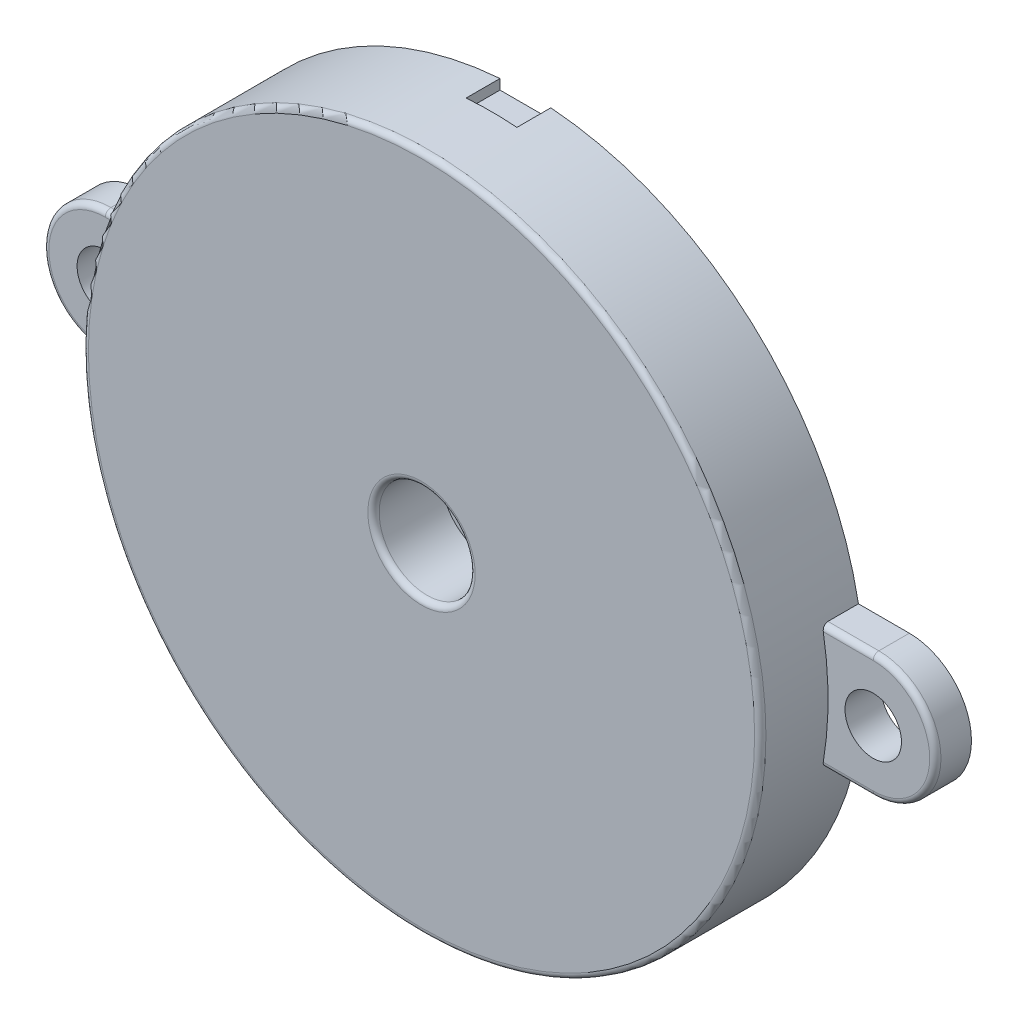
ISO-10303-21;
HEADER;
FILE_DESCRIPTION(('STEP AP214'),'2;1');
FILE_NAME('part.step','',(''),(''),'','','');
FILE_SCHEMA(('AUTOMOTIVE_DESIGN { 1 0 10303 214 1 1 1 1 }'));
ENDSEC;
DATA;
#1=APPLICATION_CONTEXT('core data for automotive mechanical design processes');
#2=APPLICATION_PROTOCOL_DEFINITION('international standard','automotive_design',2000,#1);
#3=PRODUCT_CONTEXT('',#1,'mechanical');
#4=PRODUCT('Part','Part','',(#3));
#5=PRODUCT_RELATED_PRODUCT_CATEGORY('part','',(#4));
#6=PRODUCT_DEFINITION_FORMATION('','',#4);
#7=PRODUCT_DEFINITION_CONTEXT('part definition',#1,'design');
#8=PRODUCT_DEFINITION('design','',#6,#7);
#9=PRODUCT_DEFINITION_SHAPE('','',#8);
#10=(LENGTH_UNIT() NAMED_UNIT(*) SI_UNIT(.MILLI.,.METRE.));
#11=(NAMED_UNIT(*) PLANE_ANGLE_UNIT() SI_UNIT($,.RADIAN.));
#12=(NAMED_UNIT(*) SI_UNIT($,.STERADIAN.) SOLID_ANGLE_UNIT());
#13=UNCERTAINTY_MEASURE_WITH_UNIT(LENGTH_MEASURE(1.E-05),#10,'distance_accuracy_value','');
#14=(GEOMETRIC_REPRESENTATION_CONTEXT(3) GLOBAL_UNCERTAINTY_ASSIGNED_CONTEXT((#13)) GLOBAL_UNIT_ASSIGNED_CONTEXT((#10,
#11,#12)) REPRESENTATION_CONTEXT('',''));
#15=CARTESIAN_POINT('',(0.,0.,0.));
#16=DIRECTION('',(0.,0.,1.));
#17=DIRECTION('',(1.,0.,0.));
#18=AXIS2_PLACEMENT_3D('',#15,#16,#17);
#19=CARTESIAN_POINT('',(-17.,0.,4.6));
#20=DIRECTION('',(0.,0.,1.));
#21=DIRECTION('',(1.,0.,0.));
#22=AXIS2_PLACEMENT_3D('',#19,#20,#21);
#23=PLANE('',#22);
#24=CARTESIAN_POINT('',(0.,0.,4.6));
#25=DIRECTION('',(0.,0.,1.));
#26=DIRECTION('',(1.,0.,0.));
#27=AXIS2_PLACEMENT_3D('',#24,#25,#26);
#28=CIRCLE('',#27,2.375);
#29=CARTESIAN_POINT('',(2.375,0.,4.6));
#30=VERTEX_POINT('',#29);
#31=EDGE_CURVE('E279',#30,#30,#28,.F.);
#32=ORIENTED_EDGE('',*,*,#31,.T.);
#33=EDGE_LOOP('',(#32));
#34=FACE_BOUND('',#33,.T.);
#35=CARTESIAN_POINT('',(0.,0.,4.6));
#36=DIRECTION('',(0.,0.,1.));
#37=DIRECTION('',(1.,0.,0.));
#38=AXIS2_PLACEMENT_3D('',#35,#36,#37);
#39=CIRCLE('',#38,14.75);
#40=CARTESIAN_POINT('',(14.75,0.,4.6));
#41=VERTEX_POINT('',#40);
#42=EDGE_CURVE('E276',#41,#41,#39,.T.);
#43=ORIENTED_EDGE('',*,*,#42,.T.);
#44=EDGE_LOOP('',(#43));
#45=FACE_BOUND('',#44,.T.);
#46=ADVANCED_FACE('F38',(#34,#45),#23,.T.);
#47=CARTESIAN_POINT('',(-17.,0.,4.6));
#48=DIRECTION('',(0.,0.,-1.));
#49=DIRECTION('',(-1.,0.,0.));
#50=AXIS2_PLACEMENT_3D('',#47,#48,#49);
#51=CYLINDRICAL_SURFACE('',#50,2.75);
#52=DIRECTION('',(0.,0.,-1.));
#53=VECTOR('',#52,1.);
#54=CARTESIAN_POINT('',(-17.,-2.75,4.6));
#55=LINE('',#54,#53);
#56=CARTESIAN_POINT('',(-17.,-2.75,1.35));
#57=VERTEX_POINT('',#56);
#58=CARTESIAN_POINT('',(-17.,-2.75,0.));
#59=VERTEX_POINT('',#58);
#60=EDGE_CURVE('E244',#57,#59,#55,.T.);
#61=ORIENTED_EDGE('',*,*,#60,.F.);
#62=CARTESIAN_POINT('',(-17.,0.,1.35));
#63=DIRECTION('',(0.,0.,1.));
#64=DIRECTION('',(1.,0.,0.));
#65=AXIS2_PLACEMENT_3D('',#62,#63,#64);
#66=CIRCLE('',#65,2.75);
#67=CARTESIAN_POINT('',(-17.,2.75,1.35));
#68=VERTEX_POINT('',#67);
#69=EDGE_CURVE('E284',#57,#68,#66,.F.);
#70=ORIENTED_EDGE('',*,*,#69,.T.);
#71=DIRECTION('',(0.,0.,-1.));
#72=VECTOR('',#71,1.);
#73=CARTESIAN_POINT('',(-17.,2.75,4.6));
#74=LINE('',#73,#72);
#75=CARTESIAN_POINT('',(-17.,2.75,0.));
#76=VERTEX_POINT('',#75);
#77=EDGE_CURVE('E230',#68,#76,#74,.T.);
#78=ORIENTED_EDGE('',*,*,#77,.T.);
#79=CARTESIAN_POINT('',(-17.,0.,0.));
#80=DIRECTION('',(0.,0.,1.));
#81=DIRECTION('',(1.,0.,0.));
#82=AXIS2_PLACEMENT_3D('',#79,#80,#81);
#83=CIRCLE('',#82,2.75);
#84=EDGE_CURVE('E205',#76,#59,#83,.T.);
#85=ORIENTED_EDGE('',*,*,#84,.T.);
#86=EDGE_LOOP('',(#61,#70,#78,#85));
#87=FACE_BOUND('',#86,.T.);
#88=ADVANCED_FACE('F316',(#87),#51,.T.);
#89=CARTESIAN_POINT('',(-17.,-2.75,4.6));
#90=DIRECTION('',(0.,1.,0.));
#91=DIRECTION('',(0.,0.,1.));
#92=AXIS2_PLACEMENT_3D('',#89,#90,#91);
#93=PLANE('',#92);
#94=DIRECTION('',(0.,0.,-1.));
#95=VECTOR('',#94,1.);
#96=CARTESIAN_POINT('',(-14.7457621030586,-2.75,4.6));
#97=LINE('',#96,#95);
#98=CARTESIAN_POINT('',(-14.7457621030586,-2.75,1.35));
#99=VERTEX_POINT('',#98);
#100=CARTESIAN_POINT('',(-14.7457621030586,-2.75,0.));
#101=VERTEX_POINT('',#100);
#102=EDGE_CURVE('E242',#99,#101,#97,.T.);
#103=ORIENTED_EDGE('',*,*,#102,.F.);
#104=DIRECTION('',(1.,0.,0.));
#105=VECTOR('',#104,1.);
#106=CARTESIAN_POINT('',(-17.,-2.75,1.35));
#107=LINE('',#106,#105);
#108=EDGE_CURVE('E60',#99,#57,#107,.F.);
#109=ORIENTED_EDGE('',*,*,#108,.T.);
#110=ORIENTED_EDGE('',*,*,#60,.T.);
#111=DIRECTION('',(1.,0.,0.));
#112=VECTOR('',#111,1.);
#113=CARTESIAN_POINT('',(-17.,-2.75,0.));
#114=LINE('',#113,#112);
#115=EDGE_CURVE('E208',#59,#101,#114,.T.);
#116=ORIENTED_EDGE('',*,*,#115,.T.);
#117=EDGE_LOOP('',(#103,#109,#110,#116));
#118=FACE_BOUND('',#117,.T.);
#119=ADVANCED_FACE('F361',(#118),#93,.F.);
#120=CARTESIAN_POINT('',(14.7457621030586,-2.75,4.6));
#121=DIRECTION('',(0.,1.,0.));
#122=DIRECTION('',(-1.,0.,0.));
#123=AXIS2_PLACEMENT_3D('',#120,#121,#122);
#124=PLANE('',#123);
#125=DIRECTION('',(0.,0.,-1.));
#126=VECTOR('',#125,1.);
#127=CARTESIAN_POINT('',(17.,-2.74999999999999,4.6));
#128=LINE('',#127,#126);
#129=CARTESIAN_POINT('',(17.,-2.74999999999999,1.35));
#130=VERTEX_POINT('',#129);
#131=CARTESIAN_POINT('',(17.,-2.74999999999999,0.));
#132=VERTEX_POINT('',#131);
#133=EDGE_CURVE('E238',#130,#132,#128,.T.);
#134=ORIENTED_EDGE('',*,*,#133,.F.);
#135=DIRECTION('',(1.,0.,0.));
#136=VECTOR('',#135,1.);
#137=CARTESIAN_POINT('',(14.7457621030586,-2.75,1.35));
#138=LINE('',#137,#136);
#139=CARTESIAN_POINT('',(14.7457621030586,-2.75,1.35));
#140=VERTEX_POINT('',#139);
#141=EDGE_CURVE('E259',#130,#140,#138,.F.);
#142=ORIENTED_EDGE('',*,*,#141,.T.);
#143=DIRECTION('',(0.,0.,-1.));
#144=VECTOR('',#143,1.);
#145=CARTESIAN_POINT('',(14.7457621030586,-2.75,4.6));
#146=LINE('',#145,#144);
#147=CARTESIAN_POINT('',(14.7457621030586,-2.75,0.));
#148=VERTEX_POINT('',#147);
#149=EDGE_CURVE('E240',#140,#148,#146,.T.);
#150=ORIENTED_EDGE('',*,*,#149,.T.);
#151=DIRECTION('',(1.,0.,0.));
#152=VECTOR('',#151,1.);
#153=CARTESIAN_POINT('',(14.7457621030586,-2.75,0.));
#154=LINE('',#153,#152);
#155=EDGE_CURVE('E214',#148,#132,#154,.T.);
#156=ORIENTED_EDGE('',*,*,#155,.T.);
#157=EDGE_LOOP('',(#134,#142,#150,#156));
#158=FACE_BOUND('',#157,.T.);
#159=ADVANCED_FACE('F619',(#158),#124,.F.);
#160=CARTESIAN_POINT('',(17.,0.,4.6));
#161=DIRECTION('',(0.,0.,-1.));
#162=DIRECTION('',(-1.,0.,0.));
#163=AXIS2_PLACEMENT_3D('',#160,#161,#162);
#164=CYLINDRICAL_SURFACE('',#163,2.75);
#165=DIRECTION('',(0.,0.,-1.));
#166=VECTOR('',#165,1.);
#167=CARTESIAN_POINT('',(17.,2.75,4.6));
#168=LINE('',#167,#166);
#169=CARTESIAN_POINT('',(17.,2.75,1.35));
#170=VERTEX_POINT('',#169);
#171=CARTESIAN_POINT('',(17.,2.75,0.));
#172=VERTEX_POINT('',#171);
#173=EDGE_CURVE('E236',#170,#172,#168,.T.);
#174=ORIENTED_EDGE('',*,*,#173,.F.);
#175=CARTESIAN_POINT('',(17.,0.,1.35));
#176=DIRECTION('',(0.,0.,1.));
#177=DIRECTION('',(1.,0.,0.));
#178=AXIS2_PLACEMENT_3D('',#175,#176,#177);
#179=CIRCLE('',#178,2.75);
#180=EDGE_CURVE('E282',#170,#130,#179,.F.);
#181=ORIENTED_EDGE('',*,*,#180,.T.);
#182=ORIENTED_EDGE('',*,*,#133,.T.);
#183=CARTESIAN_POINT('',(17.,0.,0.));
#184=DIRECTION('',(0.,0.,1.));
#185=DIRECTION('',(-1.,0.,0.));
#186=AXIS2_PLACEMENT_3D('',#183,#184,#185);
#187=CIRCLE('',#186,2.75);
#188=EDGE_CURVE('E217',#132,#172,#187,.T.);
#189=ORIENTED_EDGE('',*,*,#188,.T.);
#190=EDGE_LOOP('',(#174,#181,#182,#189));
#191=FACE_BOUND('',#190,.T.);
#192=ADVANCED_FACE('F381',(#191),#164,.T.);
#193=CARTESIAN_POINT('',(14.7457621030586,2.75,4.6));
#194=DIRECTION('',(0.,-1.,0.));
#195=DIRECTION('',(1.,0.,0.));
#196=AXIS2_PLACEMENT_3D('',#193,#194,#195);
#197=PLANE('',#196);
#198=DIRECTION('',(0.,0.,-1.));
#199=VECTOR('',#198,1.);
#200=CARTESIAN_POINT('',(14.7457621030586,2.75,4.6));
#201=LINE('',#200,#199);
#202=CARTESIAN_POINT('',(14.7457621030586,2.75,1.35));
#203=VERTEX_POINT('',#202);
#204=CARTESIAN_POINT('',(14.7457621030586,2.75,0.));
#205=VERTEX_POINT('',#204);
#206=EDGE_CURVE('E234',#203,#205,#201,.T.);
#207=ORIENTED_EDGE('',*,*,#206,.F.);
#208=DIRECTION('',(-1.,0.,0.));
#209=VECTOR('',#208,1.);
#210=CARTESIAN_POINT('',(17.,2.75,1.35));
#211=LINE('',#210,#209);
#212=EDGE_CURVE('E261',#203,#170,#211,.F.);
#213=ORIENTED_EDGE('',*,*,#212,.T.);
#214=ORIENTED_EDGE('',*,*,#173,.T.);
#215=DIRECTION('',(-1.,0.,0.));
#216=VECTOR('',#215,1.);
#217=CARTESIAN_POINT('',(14.7457621030586,2.75,0.));
#218=LINE('',#217,#216);
#219=EDGE_CURVE('E220',#172,#205,#218,.T.);
#220=ORIENTED_EDGE('',*,*,#219,.T.);
#221=EDGE_LOOP('',(#207,#213,#214,#220));
#222=FACE_BOUND('',#221,.T.);
#223=ADVANCED_FACE('F374',(#222),#197,.F.);
#224=CARTESIAN_POINT('',(-17.,2.75,4.6));
#225=DIRECTION('',(0.,-1.,0.));
#226=DIRECTION('',(0.,0.,-1.));
#227=AXIS2_PLACEMENT_3D('',#224,#225,#226);
#228=PLANE('',#227);
#229=ORIENTED_EDGE('',*,*,#77,.F.);
#230=DIRECTION('',(-1.,0.,0.));
#231=VECTOR('',#230,1.);
#232=CARTESIAN_POINT('',(-14.7457621030586,2.75,1.35));
#233=LINE('',#232,#231);
#234=CARTESIAN_POINT('',(-14.7457621030586,2.75,1.35));
#235=VERTEX_POINT('',#234);
#236=EDGE_CURVE('E270',#68,#235,#233,.F.);
#237=ORIENTED_EDGE('',*,*,#236,.T.);
#238=DIRECTION('',(0.,0.,-1.));
#239=VECTOR('',#238,1.);
#240=CARTESIAN_POINT('',(-14.7457621030586,2.75,4.6));
#241=LINE('',#240,#239);
#242=CARTESIAN_POINT('',(-14.7457621030586,2.75,0.));
#243=VERTEX_POINT('',#242);
#244=EDGE_CURVE('E232',#235,#243,#241,.T.);
#245=ORIENTED_EDGE('',*,*,#244,.T.);
#246=DIRECTION('',(-1.,0.,0.));
#247=VECTOR('',#246,1.);
#248=CARTESIAN_POINT('',(-17.,2.75,0.));
#249=LINE('',#248,#247);
#250=EDGE_CURVE('E227',#243,#76,#249,.T.);
#251=ORIENTED_EDGE('',*,*,#250,.T.);
#252=EDGE_LOOP('',(#229,#237,#245,#251));
#253=FACE_BOUND('',#252,.T.);
#254=ADVANCED_FACE('F372',(#253),#228,.F.);
#255=CARTESIAN_POINT('',(-17.,0.,4.6));
#256=DIRECTION('',(0.,0.,-1.));
#257=DIRECTION('',(-1.,0.,0.));
#258=AXIS2_PLACEMENT_3D('',#255,#256,#257);
#259=CYLINDRICAL_SURFACE('',#258,1.25);
#260=CARTESIAN_POINT('',(-17.,0.,0.));
#261=DIRECTION('',(0.,0.,1.));
#262=DIRECTION('',(1.,0.,0.));
#263=AXIS2_PLACEMENT_3D('',#260,#261,#262);
#264=CIRCLE('',#263,1.25);
#265=CARTESIAN_POINT('',(-15.75,0.,0.));
#266=VERTEX_POINT('',#265);
#267=EDGE_CURVE('E202',#266,#266,#264,.T.);
#268=ORIENTED_EDGE('',*,*,#267,.F.);
#269=EDGE_LOOP('',(#268));
#270=FACE_BOUND('',#269,.T.);
#271=CARTESIAN_POINT('',(-17.,0.,1.6));
#272=DIRECTION('',(0.,0.,1.));
#273=DIRECTION('',(1.,0.,0.));
#274=AXIS2_PLACEMENT_3D('',#271,#272,#273);
#275=CIRCLE('',#274,1.25);
#276=CARTESIAN_POINT('',(-15.75,0.,1.6));
#277=VERTEX_POINT('',#276);
#278=EDGE_CURVE('E188',#277,#277,#275,.F.);
#279=ORIENTED_EDGE('',*,*,#278,.F.);
#280=EDGE_LOOP('',(#279));
#281=FACE_BOUND('',#280,.T.);
#282=ADVANCED_FACE('F366',(#270,#281),#259,.F.);
#283=CARTESIAN_POINT('',(17.,0.,4.6));
#284=DIRECTION('',(0.,0.,-1.));
#285=DIRECTION('',(-1.,0.,0.));
#286=AXIS2_PLACEMENT_3D('',#283,#284,#285);
#287=CYLINDRICAL_SURFACE('',#286,1.25);
#288=CARTESIAN_POINT('',(17.,0.,0.));
#289=DIRECTION('',(0.,0.,1.));
#290=DIRECTION('',(1.,0.,0.));
#291=AXIS2_PLACEMENT_3D('',#288,#289,#290);
#292=CIRCLE('',#291,1.25);
#293=CARTESIAN_POINT('',(18.25,0.,0.));
#294=VERTEX_POINT('',#293);
#295=EDGE_CURVE('E192',#294,#294,#292,.T.);
#296=ORIENTED_EDGE('',*,*,#295,.F.);
#297=EDGE_LOOP('',(#296));
#298=FACE_BOUND('',#297,.T.);
#299=CARTESIAN_POINT('',(17.,0.,1.6));
#300=DIRECTION('',(0.,0.,1.));
#301=DIRECTION('',(1.,0.,0.));
#302=AXIS2_PLACEMENT_3D('',#299,#300,#301);
#303=CIRCLE('',#302,1.25);
#304=CARTESIAN_POINT('',(18.25,0.,1.6));
#305=VERTEX_POINT('',#304);
#306=EDGE_CURVE('E189',#305,#305,#303,.F.);
#307=ORIENTED_EDGE('',*,*,#306,.F.);
#308=EDGE_LOOP('',(#307));
#309=FACE_BOUND('',#308,.T.);
#310=ADVANCED_FACE('F370',(#298,#309),#287,.F.);
#311=CARTESIAN_POINT('',(-17.,0.,0.));
#312=DIRECTION('',(0.,0.,1.));
#313=DIRECTION('',(1.,0.,0.));
#314=AXIS2_PLACEMENT_3D('',#311,#312,#313);
#315=PLANE('',#314);
#316=CARTESIAN_POINT('',(0.,0.,0.));
#317=DIRECTION('',(0.,0.,1.));
#318=DIRECTION('',(-1.,0.,0.));
#319=AXIS2_PLACEMENT_3D('',#316,#317,#318);
#320=CIRCLE('',#319,15.);
#321=CARTESIAN_POINT('',(-1.125,14.9577530063843,0.));
#322=VERTEX_POINT('',#321);
#323=EDGE_CURVE('E223',#322,#243,#320,.T.);
#324=ORIENTED_EDGE('',*,*,#323,.F.);
#325=DIRECTION('',(0.,1.,0.));
#326=VECTOR('',#325,1.);
#327=CARTESIAN_POINT('',(-1.125,14.5127200409795,0.));
#328=LINE('',#327,#326);
#329=CARTESIAN_POINT('',(-1.125,14.5127200409795,0.));
#330=VERTEX_POINT('',#329);
#331=EDGE_CURVE('E178',#330,#322,#328,.T.);
#332=ORIENTED_EDGE('',*,*,#331,.F.);
#333=DIRECTION('',(-1.,0.,0.));
#334=VECTOR('',#333,1.);
#335=CARTESIAN_POINT('',(1.125,14.5127200409795,0.));
#336=LINE('',#335,#334);
#337=CARTESIAN_POINT('',(1.125,14.5127200409795,0.));
#338=VERTEX_POINT('',#337);
#339=EDGE_CURVE('E182',#338,#330,#336,.T.);
#340=ORIENTED_EDGE('',*,*,#339,.F.);
#341=DIRECTION('',(0.,-1.,0.));
#342=VECTOR('',#341,1.);
#343=CARTESIAN_POINT('',(1.125,14.5127200409795,0.));
#344=LINE('',#343,#342);
#345=CARTESIAN_POINT('',(1.125,14.9577530063843,0.));
#346=VERTEX_POINT('',#345);
#347=EDGE_CURVE('E167',#346,#338,#344,.T.);
#348=ORIENTED_EDGE('',*,*,#347,.F.);
#349=EDGE_CURVE('E224',#205,#346,#320,.T.);
#350=ORIENTED_EDGE('',*,*,#349,.F.);
#351=ORIENTED_EDGE('',*,*,#219,.F.);
#352=ORIENTED_EDGE('',*,*,#188,.F.);
#353=ORIENTED_EDGE('',*,*,#155,.F.);
#354=CARTESIAN_POINT('',(0.,0.,0.));
#355=DIRECTION('',(0.,0.,1.));
#356=DIRECTION('',(1.,0.,0.));
#357=AXIS2_PLACEMENT_3D('',#354,#355,#356);
#358=CIRCLE('',#357,15.);
#359=EDGE_CURVE('E211',#101,#148,#358,.T.);
#360=ORIENTED_EDGE('',*,*,#359,.F.);
#361=ORIENTED_EDGE('',*,*,#115,.F.);
#362=ORIENTED_EDGE('',*,*,#84,.F.);
#363=ORIENTED_EDGE('',*,*,#250,.F.);
#364=EDGE_LOOP('',(#324,#332,#340,#348,#350,#351,#352,#353,#360,#361,#362,#363));
#365=FACE_BOUND('',#364,.T.);
#366=ORIENTED_EDGE('',*,*,#267,.T.);
#367=EDGE_LOOP('',(#366));
#368=FACE_BOUND('',#367,.T.);
#369=ORIENTED_EDGE('',*,*,#295,.T.);
#370=EDGE_LOOP('',(#369));
#371=FACE_BOUND('',#370,.T.);
#372=ADVANCED_FACE('F368',(#365,#368,#371),#315,.F.);
#373=CARTESIAN_POINT('',(0.,0.,4.6));
#374=DIRECTION('',(0.,0.,-1.));
#375=DIRECTION('',(-1.,0.,0.));
#376=AXIS2_PLACEMENT_3D('',#373,#374,#375);
#377=CYLINDRICAL_SURFACE('',#376,15.);
#378=CARTESIAN_POINT('',(0.,0.,4.35));
#379=DIRECTION('',(0.,0.,1.));
#380=DIRECTION('',(1.,0.,0.));
#381=AXIS2_PLACEMENT_3D('',#378,#379,#380);
#382=CIRCLE('',#381,15.);
#383=CARTESIAN_POINT('',(15.,0.,4.35));
#384=VERTEX_POINT('',#383);
#385=EDGE_CURVE('E286',#384,#384,#382,.F.);
#386=ORIENTED_EDGE('',*,*,#385,.T.);
#387=EDGE_LOOP('',(#386));
#388=FACE_BOUND('',#387,.T.);
#389=CARTESIAN_POINT('',(0.,0.,1.5));
#390=DIRECTION('',(0.,0.,1.));
#391=DIRECTION('',(1.,0.,0.));
#392=AXIS2_PLACEMENT_3D('',#389,#390,#391);
#393=CIRCLE('',#392,15.);
#394=CARTESIAN_POINT('',(1.125,14.9577530063843,1.5));
#395=VERTEX_POINT('',#394);
#396=CARTESIAN_POINT('',(-1.125,14.9577530063843,1.5));
#397=VERTEX_POINT('',#396);
#398=EDGE_CURVE('E158',#395,#397,#393,.T.);
#399=ORIENTED_EDGE('',*,*,#398,.T.);
#400=DIRECTION('',(0.,0.,-1.));
#401=VECTOR('',#400,1.);
#402=CARTESIAN_POINT('',(-1.125,14.9577530063843,4.6));
#403=LINE('',#402,#401);
#404=EDGE_CURVE('E249',#397,#322,#403,.T.);
#405=ORIENTED_EDGE('',*,*,#404,.T.);
#406=ORIENTED_EDGE('',*,*,#323,.T.);
#407=ORIENTED_EDGE('',*,*,#244,.F.);
#408=CARTESIAN_POINT('',(-14.7457621030586,2.75,1.35));
#409=CARTESIAN_POINT('',(-14.7457591753939,2.75001269678549,1.36389687428884));
#410=CARTESIAN_POINT('',(-14.74597804399,2.74884206314095,1.37778864744794));
#411=CARTESIAN_POINT('',(-14.7468374042895,2.74422965962808,1.40515881181395));
#412=CARTESIAN_POINT('',(-14.7474773517124,2.74079082159479,1.4186377131864));
#413=CARTESIAN_POINT('',(-14.7491572566467,2.73173572289382,1.44482073736289));
#414=CARTESIAN_POINT('',(-14.7501973345323,2.72611880697462,1.45752462568021));
#415=CARTESIAN_POINT('',(-14.7526374663595,2.71288282158135,1.48180270274866));
#416=CARTESIAN_POINT('',(-14.754037509374,2.70526381288259,1.49337692577717));
#417=CARTESIAN_POINT('',(-14.7571596297769,2.68818067221447,1.51517039517052));
#418=CARTESIAN_POINT('',(-14.7588841298336,2.67870263494878,1.52537838910806));
#419=CARTESIAN_POINT('',(-14.762588348898,2.65821245594887,1.54406473443909));
#420=CARTESIAN_POINT('',(-14.7645681267648,2.64719996036903,1.55254268577078));
#421=CARTESIAN_POINT('',(-14.7687505633916,2.62376647620365,1.56766826169502));
#422=CARTESIAN_POINT('',(-14.7709562682722,2.61132585797252,1.57428460371459));
#423=CARTESIAN_POINT('',(-14.7754928990736,2.58553296271886,1.58533111060345));
#424=CARTESIAN_POINT('',(-14.7778237749413,2.57218104953233,1.58976214221612));
#425=CARTESIAN_POINT('',(-14.7818407761201,2.54897587882518,1.59535439320125));
#426=CARTESIAN_POINT('',(-14.7835137041685,2.53925579009771,1.59709509025225));
#427=CARTESIAN_POINT('',(-14.7868607364716,2.5196922662949,1.59941787672974));
#428=CARTESIAN_POINT('',(-14.7885348359887,2.50984901809,1.60000154742927));
#429=CARTESIAN_POINT('',(-14.790199457749,2.5,1.6));
#430=B_SPLINE_CURVE_WITH_KNOTS('',3,(#408,#409,#410,#411,#412,#413,#414,#415,#416,#417,#418,
#419,#420,#421,#422,#423,#424,#425,#426,#427,#428,#429),.UNSPECIFIED.,.F.,.F.,(4,2,2,2,2,2,2,2,
2,2,4),(0.,0.041632088029495,0.0832104684457068,0.124801366990873,0.166391003153302,
0.208304481384927,0.250227640896948,0.292818118601421,0.335391690349411,0.365373835700165,
0.395314977029406),.UNSPECIFIED.);
#431=CARTESIAN_POINT('',(-14.790199457749,2.5,1.6));
#432=VERTEX_POINT('',#431);
#433=EDGE_CURVE('E47',#235,#432,#430,.T.);
#434=ORIENTED_EDGE('',*,*,#433,.T.);
#435=CARTESIAN_POINT('',(0.,0.,1.6));
#436=DIRECTION('',(0.,0.,1.));
#437=DIRECTION('',(1.,0.,0.));
#438=AXIS2_PLACEMENT_3D('',#435,#436,#437);
#439=CIRCLE('',#438,15.);
#440=CARTESIAN_POINT('',(-14.790199457749,-2.5,1.6));
#441=VERTEX_POINT('',#440);
#442=EDGE_CURVE('E186',#432,#441,#439,.T.);
#443=ORIENTED_EDGE('',*,*,#442,.T.);
#444=CARTESIAN_POINT('',(-14.790199457749,-2.5,1.6));
#445=CARTESIAN_POINT('',(-14.7877939174117,-2.51423618618819,1.60001110324502));
#446=CARTESIAN_POINT('',(-14.7853667591021,-2.52846569132743,1.59878464281638));
#447=CARTESIAN_POINT('',(-14.7805428116712,-2.55651132523774,1.59394135401591));
#448=CARTESIAN_POINT('',(-14.7781460102417,-2.57032762485102,1.59032552823157));
#449=CARTESIAN_POINT('',(-14.7734529282084,-2.59716695019956,1.58078546488172));
#450=CARTESIAN_POINT('',(-14.7711567046747,-2.61018952715827,1.5748599351401));
#451=CARTESIAN_POINT('',(-14.7667411434912,-2.6350550536495,1.56086371083575));
#452=CARTESIAN_POINT('',(-14.7646217595381,-2.64689831212934,1.55279358013965));
#453=CARTESIAN_POINT('',(-14.7606425568051,-2.66899926492166,1.5347741253535));
#454=CARTESIAN_POINT('',(-14.7587814040234,-2.67926513990942,1.52483513565477));
#455=CARTESIAN_POINT('',(-14.7553718302988,-2.69797940177209,1.50332116209417));
#456=CARTESIAN_POINT('',(-14.7538234577915,-2.70642750717015,1.49174592532289));
#457=CARTESIAN_POINT('',(-14.7511181492783,-2.72113371021143,1.46746719882671));
#458=CARTESIAN_POINT('',(-14.7499559476862,-2.72742131137901,1.45478214573685));
#459=CARTESIAN_POINT('',(-14.7480384679688,-2.73777085886735,1.42851064001534));
#460=CARTESIAN_POINT('',(-14.7472828537276,-2.74183464361165,1.41492494239421));
#461=CARTESIAN_POINT('',(-14.746418820012,-2.74647684802593,1.39269655807596));
#462=CARTESIAN_POINT('',(-14.7461727805492,-2.7477972392028,1.38420703391143));
#463=CARTESIAN_POINT('',(-14.7458444237297,-2.74955860048462,1.36714633719354));
#464=CARTESIAN_POINT('',(-14.7457618743563,-2.75000081685312,1.35857529771705));
#465=CARTESIAN_POINT('',(-14.7457621030587,-2.75000000000046,1.35000000000009));
#466=B_SPLINE_CURVE_WITH_KNOTS('',3,(#444,#445,#446,#447,#448,#449,#450,#451,#452,#453,#454,
#455,#456,#457,#458,#459,#460,#461,#462,#463,#464,#465),.UNSPECIFIED.,.F.,.F.,(4,2,2,2,2,2,2,2,
2,2,4),(0.,0.0432579163164009,0.0864976929496637,0.12976169510576,0.173014333361319,
0.21603447602051,0.259061275449629,0.30147469118047,0.343852990670455,0.369595343869783,
0.395301138574669),.UNSPECIFIED.);
#467=EDGE_CURVE('E11',#441,#99,#466,.T.);
#468=ORIENTED_EDGE('',*,*,#467,.T.);
#469=ORIENTED_EDGE('',*,*,#102,.T.);
#470=ORIENTED_EDGE('',*,*,#359,.T.);
#471=ORIENTED_EDGE('',*,*,#149,.F.);
#472=CARTESIAN_POINT('',(14.7457621030586,-2.75,1.35));
#473=CARTESIAN_POINT('',(14.7457591753939,-2.75001269678549,1.36389687428884));
#474=CARTESIAN_POINT('',(14.74597804399,-2.74884206314095,1.37778864744794));
#475=CARTESIAN_POINT('',(14.7468374042895,-2.74422965962808,1.40515881181395));
#476=CARTESIAN_POINT('',(14.7474773517124,-2.74079082159479,1.4186377131864));
#477=CARTESIAN_POINT('',(14.7491572566467,-2.73173572289382,1.44482073736289));
#478=CARTESIAN_POINT('',(14.7501973345323,-2.72611880697462,1.45752462568021));
#479=CARTESIAN_POINT('',(14.7526374663595,-2.71288282158135,1.48180270274866));
#480=CARTESIAN_POINT('',(14.754037509374,-2.70526381288259,1.49337692577717));
#481=CARTESIAN_POINT('',(14.7571596297769,-2.68818067221447,1.51517039517052));
#482=CARTESIAN_POINT('',(14.7588841298336,-2.67870263494878,1.52537838910806));
#483=CARTESIAN_POINT('',(14.762588348898,-2.65821245594887,1.54406473443909));
#484=CARTESIAN_POINT('',(14.7645681267648,-2.64719996036903,1.55254268577078));
#485=CARTESIAN_POINT('',(14.7687505633916,-2.62376647620365,1.56766826169502));
#486=CARTESIAN_POINT('',(14.7709562682722,-2.61132585797252,1.57428460371459));
#487=CARTESIAN_POINT('',(14.7754928990736,-2.58553296271886,1.58533111060345));
#488=CARTESIAN_POINT('',(14.7778237749413,-2.57218104953233,1.58976214221612));
#489=CARTESIAN_POINT('',(14.7818407761201,-2.54897587882518,1.59535439320125));
#490=CARTESIAN_POINT('',(14.7835137041685,-2.53925579009771,1.59709509025225));
#491=CARTESIAN_POINT('',(14.7868607364716,-2.5196922662949,1.59941787672974));
#492=CARTESIAN_POINT('',(14.7885348359887,-2.50984901809,1.60000154742927));
#493=CARTESIAN_POINT('',(14.790199457749,-2.5,1.6));
#494=B_SPLINE_CURVE_WITH_KNOTS('',3,(#472,#473,#474,#475,#476,#477,#478,#479,#480,#481,#482,
#483,#484,#485,#486,#487,#488,#489,#490,#491,#492,#493),.UNSPECIFIED.,.F.,.F.,(4,2,2,2,2,2,2,2,
2,2,4),(0.,0.0416320880294948,0.0832104684457068,0.124801366990873,0.166391003153302,
0.208304481384927,0.250227640896947,0.29281811860142,0.335391690349411,0.365373835700165,
0.395314977029406),.UNSPECIFIED.);
#495=CARTESIAN_POINT('',(14.790199457749,-2.5,1.6));
#496=VERTEX_POINT('',#495);
#497=EDGE_CURVE('E289',#140,#496,#494,.T.);
#498=ORIENTED_EDGE('',*,*,#497,.T.);
#499=CARTESIAN_POINT('',(0.,0.,1.6));
#500=DIRECTION('',(0.,0.,1.));
#501=DIRECTION('',(1.,0.,0.));
#502=AXIS2_PLACEMENT_3D('',#499,#500,#501);
#503=CIRCLE('',#502,15.);
#504=CARTESIAN_POINT('',(14.790199457749,2.5,1.6));
#505=VERTEX_POINT('',#504);
#506=EDGE_CURVE('E193',#496,#505,#503,.T.);
#507=ORIENTED_EDGE('',*,*,#506,.T.);
#508=CARTESIAN_POINT('',(14.790199457749,2.5,1.6));
#509=CARTESIAN_POINT('',(14.7877939174117,2.51423618618819,1.60001110324502));
#510=CARTESIAN_POINT('',(14.7853667591021,2.52846569132743,1.59878464281638));
#511=CARTESIAN_POINT('',(14.7805428116712,2.55651132523774,1.59394135401591));
#512=CARTESIAN_POINT('',(14.7781460102417,2.57032762485102,1.59032552823157));
#513=CARTESIAN_POINT('',(14.7734529282084,2.59716695019956,1.58078546488172));
#514=CARTESIAN_POINT('',(14.7711567046747,2.61018952715827,1.5748599351401));
#515=CARTESIAN_POINT('',(14.7667411434912,2.6350550536495,1.56086371083575));
#516=CARTESIAN_POINT('',(14.7646217595381,2.64689831212934,1.55279358013965));
#517=CARTESIAN_POINT('',(14.7606425568051,2.66899926492166,1.5347741253535));
#518=CARTESIAN_POINT('',(14.7587814040234,2.67926513990942,1.52483513565477));
#519=CARTESIAN_POINT('',(14.7553718302988,2.69797940177209,1.50332116209417));
#520=CARTESIAN_POINT('',(14.7538234577915,2.70642750717015,1.49174592532289));
#521=CARTESIAN_POINT('',(14.7511181492783,2.72113371021143,1.46746719882671));
#522=CARTESIAN_POINT('',(14.7499559476862,2.72742131137901,1.45478214573686));
#523=CARTESIAN_POINT('',(14.7480384679688,2.73777085886735,1.42851064001534));
#524=CARTESIAN_POINT('',(14.7472828537276,2.74183464361165,1.41492494239421));
#525=CARTESIAN_POINT('',(14.746418820012,2.74647684802593,1.39269655807596));
#526=CARTESIAN_POINT('',(14.7461727805492,2.7477972392028,1.38420703391143));
#527=CARTESIAN_POINT('',(14.7458444237297,2.74955860048462,1.36714633719354));
#528=CARTESIAN_POINT('',(14.7457618743563,2.75000081685312,1.35857529771705));
#529=CARTESIAN_POINT('',(14.7457621030587,2.75000000000046,1.35000000000009));
#530=B_SPLINE_CURVE_WITH_KNOTS('',3,(#508,#509,#510,#511,#512,#513,#514,#515,#516,#517,#518,
#519,#520,#521,#522,#523,#524,#525,#526,#527,#528,#529),.UNSPECIFIED.,.F.,.F.,(4,2,2,2,2,2,2,2,
2,2,4),(0.,0.0432579163164009,0.0864976929496633,0.129761695105759,0.173014333361319,
0.216034476020509,0.259061275449629,0.301474691180469,0.343852990670454,0.369595343869783,
0.395301138574669),.UNSPECIFIED.);
#531=EDGE_CURVE('E297',#505,#203,#530,.T.);
#532=ORIENTED_EDGE('',*,*,#531,.T.);
#533=ORIENTED_EDGE('',*,*,#206,.T.);
#534=ORIENTED_EDGE('',*,*,#349,.T.);
#535=DIRECTION('',(0.,0.,-1.));
#536=VECTOR('',#535,1.);
#537=CARTESIAN_POINT('',(1.125,14.9577530063843,4.6));
#538=LINE('',#537,#536);
#539=EDGE_CURVE('E247',#346,#395,#538,.F.);
#540=ORIENTED_EDGE('',*,*,#539,.T.);
#541=EDGE_LOOP('',(#399,#405,#406,#407,#434,#443,#468,#469,#470,#471,#498,#507,#532,#533,#534,#540));
#542=FACE_BOUND('',#541,.T.);
#543=ADVANCED_FACE('F304',(#388,#542),#377,.T.);
#544=CARTESIAN_POINT('',(0.,0.,1.6));
#545=DIRECTION('',(0.,0.,1.));
#546=DIRECTION('',(1.,0.,0.));
#547=AXIS2_PLACEMENT_3D('',#544,#545,#546);
#548=PLANE('',#547);
#549=ORIENTED_EDGE('',*,*,#506,.F.);
#550=DIRECTION('',(1.,0.,0.));
#551=VECTOR('',#550,1.);
#552=CARTESIAN_POINT('',(17.,-2.49999999999999,1.6));
#553=LINE('',#552,#551);
#554=CARTESIAN_POINT('',(17.,-2.49999999999999,1.6));
#555=VERTEX_POINT('',#554);
#556=EDGE_CURVE('E256',#496,#555,#553,.T.);
#557=ORIENTED_EDGE('',*,*,#556,.T.);
#558=CARTESIAN_POINT('',(17.,0.,1.6));
#559=DIRECTION('',(0.,0.,1.));
#560=DIRECTION('',(1.,0.,0.));
#561=AXIS2_PLACEMENT_3D('',#558,#559,#560);
#562=CIRCLE('',#561,2.5);
#563=CARTESIAN_POINT('',(17.,2.5,1.6));
#564=VERTEX_POINT('',#563);
#565=EDGE_CURVE('E252',#555,#564,#562,.T.);
#566=ORIENTED_EDGE('',*,*,#565,.T.);
#567=DIRECTION('',(-1.,0.,0.));
#568=VECTOR('',#567,1.);
#569=CARTESIAN_POINT('',(14.7457621030586,2.5,1.6));
#570=LINE('',#569,#568);
#571=EDGE_CURVE('E254',#564,#505,#570,.T.);
#572=ORIENTED_EDGE('',*,*,#571,.T.);
#573=EDGE_LOOP('',(#549,#557,#566,#572));
#574=FACE_BOUND('',#573,.T.);
#575=ORIENTED_EDGE('',*,*,#306,.T.);
#576=EDGE_LOOP('',(#575));
#577=FACE_BOUND('',#576,.T.);
#578=ADVANCED_FACE('F407',(#574,#577),#548,.T.);
#579=CARTESIAN_POINT('',(0.,0.,1.6));
#580=DIRECTION('',(0.,0.,1.));
#581=DIRECTION('',(1.,0.,0.));
#582=AXIS2_PLACEMENT_3D('',#579,#580,#581);
#583=PLANE('',#582);
#584=ORIENTED_EDGE('',*,*,#442,.F.);
#585=DIRECTION('',(-1.,0.,0.));
#586=VECTOR('',#585,1.);
#587=CARTESIAN_POINT('',(-17.,2.5,1.6));
#588=LINE('',#587,#586);
#589=CARTESIAN_POINT('',(-17.,2.5,1.6));
#590=VERTEX_POINT('',#589);
#591=EDGE_CURVE('E267',#432,#590,#588,.T.);
#592=ORIENTED_EDGE('',*,*,#591,.T.);
#593=CARTESIAN_POINT('',(-17.,0.,1.6));
#594=DIRECTION('',(0.,0.,1.));
#595=DIRECTION('',(1.,0.,0.));
#596=AXIS2_PLACEMENT_3D('',#593,#594,#595);
#597=CIRCLE('',#596,2.5);
#598=CARTESIAN_POINT('',(-17.,-2.5,1.6));
#599=VERTEX_POINT('',#598);
#600=EDGE_CURVE('E263',#590,#599,#597,.T.);
#601=ORIENTED_EDGE('',*,*,#600,.T.);
#602=DIRECTION('',(1.,0.,0.));
#603=VECTOR('',#602,1.);
#604=CARTESIAN_POINT('',(-14.7457621030586,-2.5,1.6));
#605=LINE('',#604,#603);
#606=EDGE_CURVE('E265',#599,#441,#605,.T.);
#607=ORIENTED_EDGE('',*,*,#606,.T.);
#608=EDGE_LOOP('',(#584,#592,#601,#607));
#609=FACE_BOUND('',#608,.T.);
#610=ORIENTED_EDGE('',*,*,#278,.T.);
#611=EDGE_LOOP('',(#610));
#612=FACE_BOUND('',#611,.T.);
#613=ADVANCED_FACE('F432',(#609,#612),#583,.T.);
#614=CARTESIAN_POINT('',(0.,0.,1.6));
#615=DIRECTION('',(0.,0.,1.));
#616=DIRECTION('',(1.,0.,0.));
#617=AXIS2_PLACEMENT_3D('',#614,#615,#616);
#618=CYLINDRICAL_SURFACE('',#617,2.125);
#619=CARTESIAN_POINT('',(0.,0.,4.35));
#620=DIRECTION('',(0.,0.,1.));
#621=DIRECTION('',(1.,0.,0.));
#622=AXIS2_PLACEMENT_3D('',#619,#620,#621);
#623=CIRCLE('',#622,2.125);
#624=CARTESIAN_POINT('',(2.125,0.,4.35));
#625=VERTEX_POINT('',#624);
#626=EDGE_CURVE('E273',#625,#625,#623,.T.);
#627=ORIENTED_EDGE('',*,*,#626,.T.);
#628=EDGE_LOOP('',(#627));
#629=FACE_BOUND('',#628,.T.);
#630=CARTESIAN_POINT('',(0.,0.,1.6));
#631=DIRECTION('',(0.,0.,1.));
#632=DIRECTION('',(1.,0.,0.));
#633=AXIS2_PLACEMENT_3D('',#630,#631,#632);
#634=CIRCLE('',#633,2.125);
#635=CARTESIAN_POINT('',(2.125,0.,1.6));
#636=VERTEX_POINT('',#635);
#637=EDGE_CURVE('E184',#636,#636,#634,.T.);
#638=ORIENTED_EDGE('',*,*,#637,.F.);
#639=EDGE_LOOP('',(#638));
#640=FACE_BOUND('',#639,.T.);
#641=ADVANCED_FACE('F435',(#629,#640),#618,.F.);
#642=CARTESIAN_POINT('',(0.,0.,1.6));
#643=DIRECTION('',(0.,0.,1.));
#644=DIRECTION('',(1.,0.,0.));
#645=AXIS2_PLACEMENT_3D('',#642,#643,#644);
#646=PLANE('',#645);
#647=ORIENTED_EDGE('',*,*,#637,.T.);
#648=EDGE_LOOP('',(#647));
#649=FACE_BOUND('',#648,.T.);
#650=ADVANCED_FACE('F443',(#649),#646,.T.);
#651=CARTESIAN_POINT('',(-1.125,14.5127200409795,1.5));
#652=DIRECTION('',(-1.,0.,0.));
#653=DIRECTION('',(0.,0.,1.));
#654=AXIS2_PLACEMENT_3D('',#651,#652,#653);
#655=PLANE('',#654);
#656=DIRECTION('',(0.,1.,0.));
#657=VECTOR('',#656,1.);
#658=CARTESIAN_POINT('',(-1.125,14.5127200409795,1.5));
#659=LINE('',#658,#657);
#660=CARTESIAN_POINT('',(-1.125,14.5127200409795,1.5));
#661=VERTEX_POINT('',#660);
#662=EDGE_CURVE('E161',#661,#397,#659,.T.);
#663=ORIENTED_EDGE('',*,*,#662,.F.);
#664=DIRECTION('',(0.,0.,-1.));
#665=VECTOR('',#664,1.);
#666=CARTESIAN_POINT('',(-1.125,14.5127200409795,1.5));
#667=LINE('',#666,#665);
#668=EDGE_CURVE('E171',#661,#330,#667,.T.);
#669=ORIENTED_EDGE('',*,*,#668,.T.);
#670=ORIENTED_EDGE('',*,*,#331,.T.);
#671=ORIENTED_EDGE('',*,*,#404,.F.);
#672=EDGE_LOOP('',(#663,#669,#670,#671));
#673=FACE_BOUND('',#672,.T.);
#674=ADVANCED_FACE('F448',(#673),#655,.F.);
#675=CARTESIAN_POINT('',(1.125,14.5127200409795,1.5));
#676=DIRECTION('',(1.,0.,0.));
#677=DIRECTION('',(0.,0.,-1.));
#678=AXIS2_PLACEMENT_3D('',#675,#676,#677);
#679=PLANE('',#678);
#680=ORIENTED_EDGE('',*,*,#347,.T.);
#681=DIRECTION('',(0.,0.,-1.));
#682=VECTOR('',#681,1.);
#683=CARTESIAN_POINT('',(1.125,14.5127200409795,1.5));
#684=LINE('',#683,#682);
#685=CARTESIAN_POINT('',(1.125,14.5127200409795,1.5));
#686=VERTEX_POINT('',#685);
#687=EDGE_CURVE('E164',#686,#338,#684,.T.);
#688=ORIENTED_EDGE('',*,*,#687,.F.);
#689=DIRECTION('',(0.,-1.,0.));
#690=VECTOR('',#689,1.);
#691=CARTESIAN_POINT('',(1.125,14.5127200409795,1.5));
#692=LINE('',#691,#690);
#693=EDGE_CURVE('E152',#395,#686,#692,.T.);
#694=ORIENTED_EDGE('',*,*,#693,.F.);
#695=ORIENTED_EDGE('',*,*,#539,.F.);
#696=EDGE_LOOP('',(#680,#688,#694,#695));
#697=FACE_BOUND('',#696,.T.);
#698=ADVANCED_FACE('F165',(#697),#679,.F.);
#699=CARTESIAN_POINT('',(0.,0.,1.5));
#700=DIRECTION('',(0.,0.,1.));
#701=DIRECTION('',(1.,0.,0.));
#702=AXIS2_PLACEMENT_3D('',#699,#700,#701);
#703=PLANE('',#702);
#704=ORIENTED_EDGE('',*,*,#693,.T.);
#705=DIRECTION('',(-1.,0.,0.));
#706=VECTOR('',#705,1.);
#707=CARTESIAN_POINT('',(1.125,14.5127200409795,1.5));
#708=LINE('',#707,#706);
#709=EDGE_CURVE('E156',#686,#661,#708,.T.);
#710=ORIENTED_EDGE('',*,*,#709,.T.);
#711=ORIENTED_EDGE('',*,*,#662,.T.);
#712=ORIENTED_EDGE('',*,*,#398,.F.);
#713=EDGE_LOOP('',(#704,#710,#711,#712));
#714=FACE_BOUND('',#713,.T.);
#715=ADVANCED_FACE('F154',(#714),#703,.F.);
#716=CARTESIAN_POINT('',(1.125,14.5127200409795,1.5));
#717=DIRECTION('',(0.,-1.,0.));
#718=DIRECTION('',(0.,0.,-1.));
#719=AXIS2_PLACEMENT_3D('',#716,#717,#718);
#720=PLANE('',#719);
#721=ORIENTED_EDGE('',*,*,#339,.T.);
#722=ORIENTED_EDGE('',*,*,#668,.F.);
#723=ORIENTED_EDGE('',*,*,#709,.F.);
#724=ORIENTED_EDGE('',*,*,#687,.T.);
#725=EDGE_LOOP('',(#721,#722,#723,#724));
#726=FACE_BOUND('',#725,.T.);
#727=ADVANCED_FACE('F173',(#726),#720,.F.);
#728=CARTESIAN_POINT('',(0.,2.49999999999996,1.35));
#729=DIRECTION('',(1.,0.,0.));
#730=DIRECTION('',(0.,1.,0.));
#731=AXIS2_PLACEMENT_3D('',#728,#729,#730);
#732=CYLINDRICAL_SURFACE('',#731,0.25);
#733=ORIENTED_EDGE('',*,*,#531,.F.);
#734=ORIENTED_EDGE('',*,*,#571,.F.);
#735=CARTESIAN_POINT('',(17.,2.5,1.35));
#736=DIRECTION('',(1.,0.,0.));
#737=DIRECTION('',(0.,0.,-1.));
#738=AXIS2_PLACEMENT_3D('',#735,#736,#737);
#739=CIRCLE('',#738,0.25);
#740=EDGE_CURVE('E180',#170,#564,#739,.T.);
#741=ORIENTED_EDGE('',*,*,#740,.F.);
#742=ORIENTED_EDGE('',*,*,#212,.F.);
#743=EDGE_LOOP('',(#733,#734,#741,#742));
#744=FACE_BOUND('',#743,.T.);
#745=ADVANCED_FACE('F319',(#744),#732,.T.);
#746=CARTESIAN_POINT('',(17.,0.,1.35));
#747=DIRECTION('',(0.,0.,1.));
#748=DIRECTION('',(1.,0.,0.));
#749=AXIS2_PLACEMENT_3D('',#746,#747,#748);
#750=TOROIDAL_SURFACE('',#749,2.5,0.25);
#751=ORIENTED_EDGE('',*,*,#740,.T.);
#752=ORIENTED_EDGE('',*,*,#565,.F.);
#753=CARTESIAN_POINT('',(17.,-2.49999999999999,1.35));
#754=DIRECTION('',(-1.,0.,0.));
#755=DIRECTION('',(0.,0.,1.));
#756=AXIS2_PLACEMENT_3D('',#753,#754,#755);
#757=CIRCLE('',#756,0.25);
#758=EDGE_CURVE('E342',#130,#555,#757,.T.);
#759=ORIENTED_EDGE('',*,*,#758,.F.);
#760=ORIENTED_EDGE('',*,*,#180,.F.);
#761=EDGE_LOOP('',(#751,#752,#759,#760));
#762=FACE_BOUND('',#761,.T.);
#763=ADVANCED_FACE('F314',(#762),#750,.T.);
#764=CARTESIAN_POINT('',(0.,-2.50000000000004,1.35));
#765=DIRECTION('',(-1.,0.,0.));
#766=DIRECTION('',(0.,-1.,0.));
#767=AXIS2_PLACEMENT_3D('',#764,#765,#766);
#768=CYLINDRICAL_SURFACE('',#767,0.25);
#769=ORIENTED_EDGE('',*,*,#497,.F.);
#770=ORIENTED_EDGE('',*,*,#141,.F.);
#771=ORIENTED_EDGE('',*,*,#758,.T.);
#772=ORIENTED_EDGE('',*,*,#556,.F.);
#773=EDGE_LOOP('',(#769,#770,#771,#772));
#774=FACE_BOUND('',#773,.T.);
#775=ADVANCED_FACE('F308',(#774),#768,.T.);
#776=CARTESIAN_POINT('',(0.,-2.5,1.35));
#777=DIRECTION('',(-1.,0.,0.));
#778=DIRECTION('',(0.,0.,1.));
#779=AXIS2_PLACEMENT_3D('',#776,#777,#778);
#780=CYLINDRICAL_SURFACE('',#779,0.25);
#781=ORIENTED_EDGE('',*,*,#467,.F.);
#782=ORIENTED_EDGE('',*,*,#606,.F.);
#783=CARTESIAN_POINT('',(-17.,-2.5,1.35));
#784=DIRECTION('',(-1.,0.,0.));
#785=DIRECTION('',(0.,0.,1.));
#786=AXIS2_PLACEMENT_3D('',#783,#784,#785);
#787=CIRCLE('',#786,0.25);
#788=EDGE_CURVE('E42',#57,#599,#787,.T.);
#789=ORIENTED_EDGE('',*,*,#788,.F.);
#790=ORIENTED_EDGE('',*,*,#108,.F.);
#791=EDGE_LOOP('',(#781,#782,#789,#790));
#792=FACE_BOUND('',#791,.T.);
#793=ADVANCED_FACE('F313',(#792),#780,.T.);
#794=CARTESIAN_POINT('',(-17.,0.,1.35));
#795=DIRECTION('',(0.,0.,1.));
#796=DIRECTION('',(1.,0.,0.));
#797=AXIS2_PLACEMENT_3D('',#794,#795,#796);
#798=TOROIDAL_SURFACE('',#797,2.5,0.25);
#799=ORIENTED_EDGE('',*,*,#788,.T.);
#800=ORIENTED_EDGE('',*,*,#600,.F.);
#801=CARTESIAN_POINT('',(-17.,2.5,1.35));
#802=DIRECTION('',(1.,0.,0.));
#803=DIRECTION('',(0.,0.,-1.));
#804=AXIS2_PLACEMENT_3D('',#801,#802,#803);
#805=CIRCLE('',#804,0.25);
#806=EDGE_CURVE('E391',#68,#590,#805,.T.);
#807=ORIENTED_EDGE('',*,*,#806,.F.);
#808=ORIENTED_EDGE('',*,*,#69,.F.);
#809=EDGE_LOOP('',(#799,#800,#807,#808));
#810=FACE_BOUND('',#809,.T.);
#811=ADVANCED_FACE('F330',(#810),#798,.T.);
#812=CARTESIAN_POINT('',(0.,2.5,1.35));
#813=DIRECTION('',(1.,0.,0.));
#814=DIRECTION('',(0.,0.,-1.));
#815=AXIS2_PLACEMENT_3D('',#812,#813,#814);
#816=CYLINDRICAL_SURFACE('',#815,0.25);
#817=ORIENTED_EDGE('',*,*,#433,.F.);
#818=ORIENTED_EDGE('',*,*,#236,.F.);
#819=ORIENTED_EDGE('',*,*,#806,.T.);
#820=ORIENTED_EDGE('',*,*,#591,.F.);
#821=EDGE_LOOP('',(#817,#818,#819,#820));
#822=FACE_BOUND('',#821,.T.);
#823=ADVANCED_FACE('F325',(#822),#816,.T.);
#824=CARTESIAN_POINT('',(0.,0.,4.35));
#825=DIRECTION('',(0.,0.,1.));
#826=DIRECTION('',(1.,0.,0.));
#827=AXIS2_PLACEMENT_3D('',#824,#825,#826);
#828=TOROIDAL_SURFACE('',#827,2.375,0.25);
#829=ORIENTED_EDGE('',*,*,#31,.F.);
#830=EDGE_LOOP('',(#829));
#831=FACE_BOUND('',#830,.T.);
#832=ORIENTED_EDGE('',*,*,#626,.F.);
#833=EDGE_LOOP('',(#832));
#834=FACE_BOUND('',#833,.T.);
#835=ADVANCED_FACE('F329',(#831,#834),#828,.T.);
#836=CARTESIAN_POINT('',(0.,0.,4.35));
#837=DIRECTION('',(0.,0.,1.));
#838=DIRECTION('',(1.,0.,0.));
#839=AXIS2_PLACEMENT_3D('',#836,#837,#838);
#840=TOROIDAL_SURFACE('',#839,14.75,0.25);
#841=ORIENTED_EDGE('',*,*,#385,.F.);
#842=EDGE_LOOP('',(#841));
#843=FACE_BOUND('',#842,.T.);
#844=ORIENTED_EDGE('',*,*,#42,.F.);
#845=EDGE_LOOP('',(#844));
#846=FACE_BOUND('',#845,.T.);
#847=ADVANCED_FACE('F40',(#843,#846),#840,.T.);
#848=CLOSED_SHELL('',(#46,#88,#119,#159,#192,#223,#254,#282,#310,#372,#543,#578,#613,#641,#650,
#674,#698,#715,#727,#745,#763,#775,#793,#811,#823,#835,#847));
#849=MANIFOLD_SOLID_BREP('B2',#848);
#850=ADVANCED_BREP_SHAPE_REPRESENTATION('',(#18,#849),#14);
#851=SHAPE_DEFINITION_REPRESENTATION(#9,#850);
ENDSEC;
END-ISO-10303-21;
